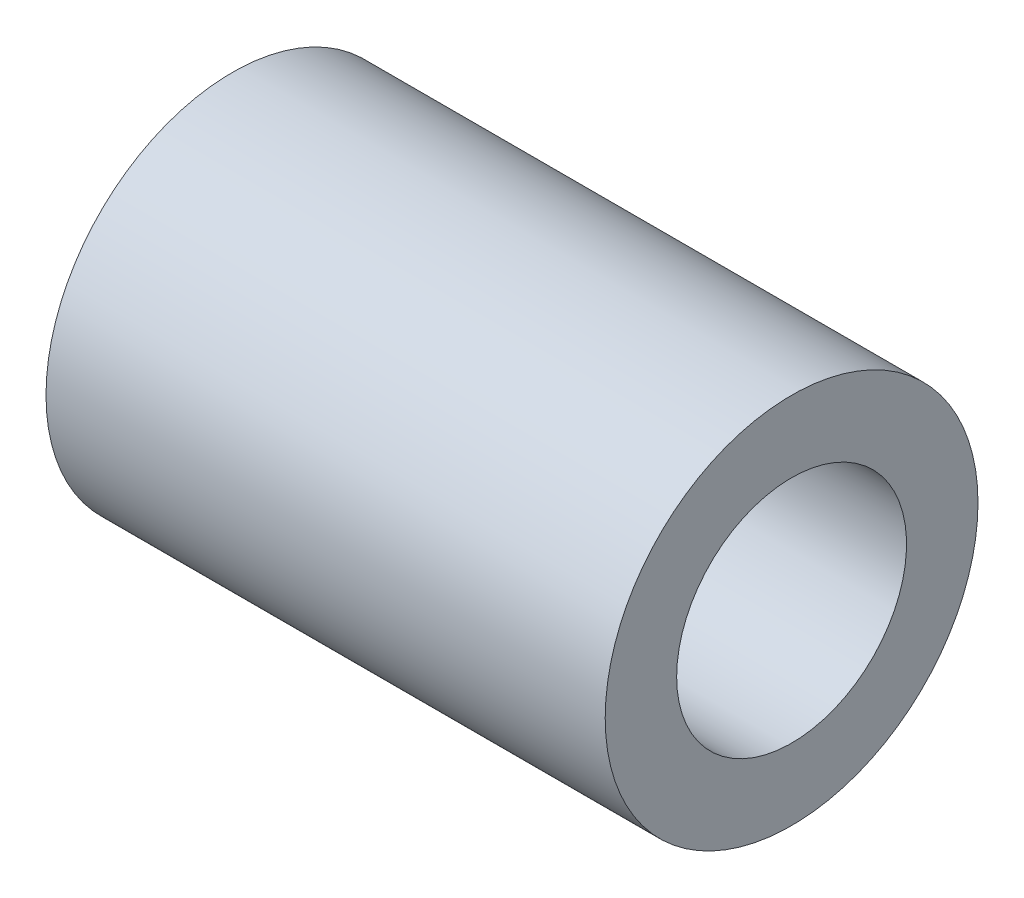
ISO-10303-21;
HEADER;
FILE_DESCRIPTION(('STEP AP214'),'2;1');
FILE_NAME('part.step','',(''),(''),'','','');
FILE_SCHEMA(('AUTOMOTIVE_DESIGN { 1 0 10303 214 1 1 1 1 }'));
ENDSEC;
DATA;
#1=APPLICATION_CONTEXT('core data for automotive mechanical design processes');
#2=APPLICATION_PROTOCOL_DEFINITION('international standard','automotive_design',2000,#1);
#3=PRODUCT_CONTEXT('',#1,'mechanical');
#4=PRODUCT('Part','Part','',(#3));
#5=PRODUCT_RELATED_PRODUCT_CATEGORY('part','',(#4));
#6=PRODUCT_DEFINITION_FORMATION('','',#4);
#7=PRODUCT_DEFINITION_CONTEXT('part definition',#1,'design');
#8=PRODUCT_DEFINITION('design','',#6,#7);
#9=PRODUCT_DEFINITION_SHAPE('','',#8);
#10=(LENGTH_UNIT() NAMED_UNIT(*) SI_UNIT(.MILLI.,.METRE.));
#11=(NAMED_UNIT(*) PLANE_ANGLE_UNIT() SI_UNIT($,.RADIAN.));
#12=(NAMED_UNIT(*) SI_UNIT($,.STERADIAN.) SOLID_ANGLE_UNIT());
#13=UNCERTAINTY_MEASURE_WITH_UNIT(LENGTH_MEASURE(1.E-05),#10,'distance_accuracy_value','');
#14=(GEOMETRIC_REPRESENTATION_CONTEXT(3) GLOBAL_UNCERTAINTY_ASSIGNED_CONTEXT((#13)) GLOBAL_UNIT_ASSIGNED_CONTEXT((#10,
#11,#12)) REPRESENTATION_CONTEXT('',''));
#15=CARTESIAN_POINT('',(0.,0.,0.));
#16=DIRECTION('',(0.,0.,1.));
#17=DIRECTION('',(1.,0.,0.));
#18=AXIS2_PLACEMENT_3D('',#15,#16,#17);
#19=CARTESIAN_POINT('',(8.99999999999975,3.,0.));
#20=DIRECTION('',(-1.,0.,0.));
#21=DIRECTION('',(0.,0.,1.));
#22=AXIS2_PLACEMENT_3D('',#19,#20,#21);
#23=PLANE('',#22);
#24=CARTESIAN_POINT('',(8.99999999999967,0.,0.));
#25=DIRECTION('',(-1.,0.,0.));
#26=DIRECTION('',(0.,0.,1.));
#27=AXIS2_PLACEMENT_3D('',#24,#25,#26);
#28=CIRCLE('',#27,3.);
#29=CARTESIAN_POINT('',(8.99999999999967,0.,3.));
#30=VERTEX_POINT('',#29);
#31=EDGE_CURVE('E44',#30,#30,#28,.T.);
#32=ORIENTED_EDGE('',*,*,#31,.F.);
#33=EDGE_LOOP('',(#32));
#34=FACE_BOUND('',#33,.T.);
#35=CARTESIAN_POINT('',(8.99999999999967,0.,0.));
#36=DIRECTION('',(-1.,0.,0.));
#37=DIRECTION('',(0.,0.,1.));
#38=AXIS2_PLACEMENT_3D('',#35,#36,#37);
#39=CIRCLE('',#38,1.85);
#40=CARTESIAN_POINT('',(8.99999999999967,0.,1.85));
#41=VERTEX_POINT('',#40);
#42=EDGE_CURVE('E10',#41,#41,#39,.T.);
#43=ORIENTED_EDGE('',*,*,#42,.T.);
#44=EDGE_LOOP('',(#43));
#45=FACE_BOUND('',#44,.T.);
#46=ADVANCED_FACE('F30',(#34,#45),#23,.F.);
#47=CARTESIAN_POINT('',(-1000.,0.,0.));
#48=DIRECTION('',(-1.,0.,0.));
#49=DIRECTION('',(0.,0.,1.));
#50=AXIS2_PLACEMENT_3D('',#47,#48,#49);
#51=CYLINDRICAL_SURFACE('',#50,1.85);
#52=ORIENTED_EDGE('',*,*,#42,.F.);
#53=EDGE_LOOP('',(#52));
#54=FACE_BOUND('',#53,.T.);
#55=CARTESIAN_POINT('',(-2.22044604925031E-13,0.,0.));
#56=DIRECTION('',(-1.,0.,0.));
#57=DIRECTION('',(0.,0.,1.));
#58=AXIS2_PLACEMENT_3D('',#55,#56,#57);
#59=CIRCLE('',#58,1.85);
#60=CARTESIAN_POINT('',(-2.22044604925031E-13,0.,1.85));
#61=VERTEX_POINT('',#60);
#62=EDGE_CURVE('E36',#61,#61,#59,.T.);
#63=ORIENTED_EDGE('',*,*,#62,.T.);
#64=EDGE_LOOP('',(#63));
#65=FACE_BOUND('',#64,.T.);
#66=ADVANCED_FACE('F53',(#54,#65),#51,.F.);
#67=CARTESIAN_POINT('',(-2.4611389315421E-13,3.,0.));
#68=DIRECTION('',(1.,0.,0.));
#69=DIRECTION('',(0.,0.,-1.));
#70=AXIS2_PLACEMENT_3D('',#67,#68,#69);
#71=PLANE('',#70);
#72=ORIENTED_EDGE('',*,*,#62,.F.);
#73=EDGE_LOOP('',(#72));
#74=FACE_BOUND('',#73,.T.);
#75=CARTESIAN_POINT('',(-2.22044604925031E-13,0.,0.));
#76=DIRECTION('',(-1.,0.,0.));
#77=DIRECTION('',(0.,0.,1.));
#78=AXIS2_PLACEMENT_3D('',#75,#76,#77);
#79=CIRCLE('',#78,3.);
#80=CARTESIAN_POINT('',(-2.22044604925031E-13,0.,3.));
#81=VERTEX_POINT('',#80);
#82=EDGE_CURVE('E40',#81,#81,#79,.T.);
#83=ORIENTED_EDGE('',*,*,#82,.T.);
#84=EDGE_LOOP('',(#83));
#85=FACE_BOUND('',#84,.T.);
#86=ADVANCED_FACE('F57',(#74,#85),#71,.F.);
#87=CARTESIAN_POINT('',(-1000.,0.,0.));
#88=DIRECTION('',(-1.,0.,0.));
#89=DIRECTION('',(0.,0.,1.));
#90=AXIS2_PLACEMENT_3D('',#87,#88,#89);
#91=CYLINDRICAL_SURFACE('',#90,3.);
#92=ORIENTED_EDGE('',*,*,#82,.F.);
#93=EDGE_LOOP('',(#92));
#94=FACE_BOUND('',#93,.T.);
#95=ORIENTED_EDGE('',*,*,#31,.T.);
#96=EDGE_LOOP('',(#95));
#97=FACE_BOUND('',#96,.T.);
#98=ADVANCED_FACE('F50',(#94,#97),#91,.T.);
#99=CLOSED_SHELL('',(#46,#66,#86,#98));
#100=MANIFOLD_SOLID_BREP('B2',#99);
#101=ADVANCED_BREP_SHAPE_REPRESENTATION('',(#18,#100),#14);
#102=SHAPE_DEFINITION_REPRESENTATION(#9,#101);
ENDSEC;
END-ISO-10303-21;
